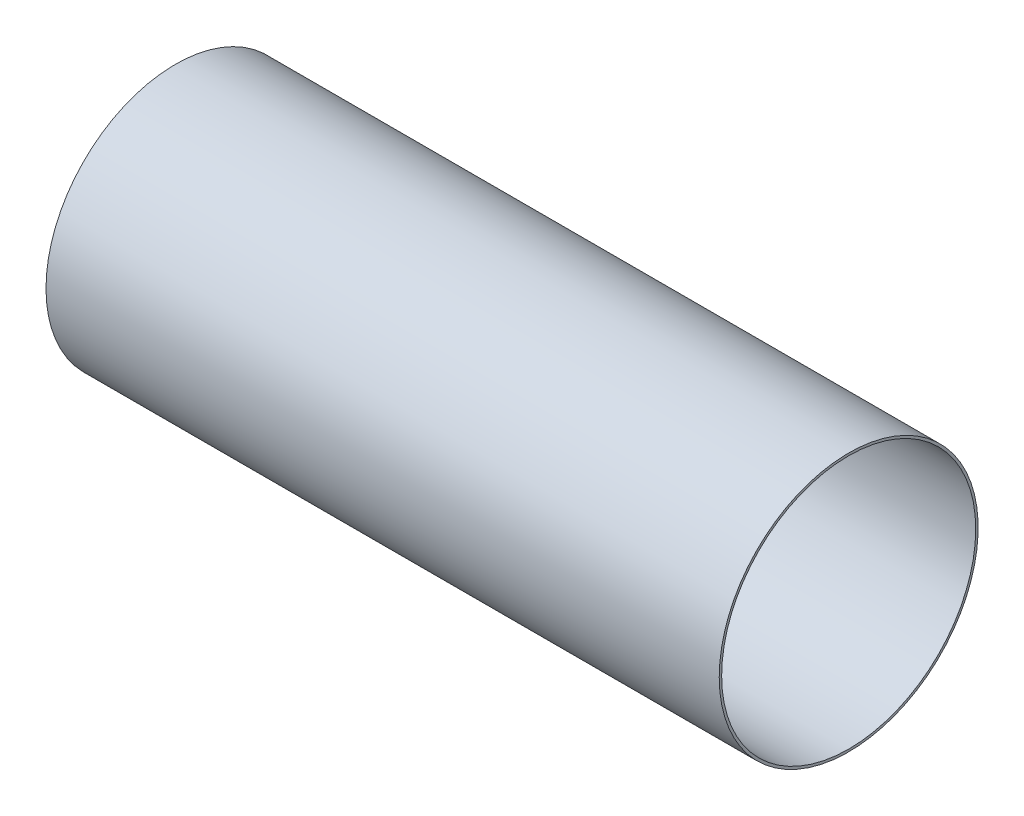
ISO-10303-21;
HEADER;
FILE_DESCRIPTION(('STEP AP214'),'2;1');
FILE_NAME('part.step','',(''),(''),'','','');
FILE_SCHEMA(('AUTOMOTIVE_DESIGN { 1 0 10303 214 1 1 1 1 }'));
ENDSEC;
DATA;
#1=APPLICATION_CONTEXT('core data for automotive mechanical design processes');
#2=APPLICATION_PROTOCOL_DEFINITION('international standard','automotive_design',2000,#1);
#3=PRODUCT_CONTEXT('',#1,'mechanical');
#4=PRODUCT('Part','Part','',(#3));
#5=PRODUCT_RELATED_PRODUCT_CATEGORY('part','',(#4));
#6=PRODUCT_DEFINITION_FORMATION('','',#4);
#7=PRODUCT_DEFINITION_CONTEXT('part definition',#1,'design');
#8=PRODUCT_DEFINITION('design','',#6,#7);
#9=PRODUCT_DEFINITION_SHAPE('','',#8);
#10=(LENGTH_UNIT() NAMED_UNIT(*) SI_UNIT(.MILLI.,.METRE.));
#11=(NAMED_UNIT(*) PLANE_ANGLE_UNIT() SI_UNIT($,.RADIAN.));
#12=(NAMED_UNIT(*) SI_UNIT($,.STERADIAN.) SOLID_ANGLE_UNIT());
#13=UNCERTAINTY_MEASURE_WITH_UNIT(LENGTH_MEASURE(1.E-05),#10,'distance_accuracy_value','');
#14=(GEOMETRIC_REPRESENTATION_CONTEXT(3) GLOBAL_UNCERTAINTY_ASSIGNED_CONTEXT((#13)) GLOBAL_UNIT_ASSIGNED_CONTEXT((#10,
#11,#12)) REPRESENTATION_CONTEXT('',''));
#15=CARTESIAN_POINT('',(0.,0.,0.));
#16=DIRECTION('',(0.,0.,1.));
#17=DIRECTION('',(1.,0.,0.));
#18=AXIS2_PLACEMENT_3D('',#15,#16,#17);
#19=CARTESIAN_POINT('',(832.,0.,0.));
#20=DIRECTION('',(1.,0.,0.));
#21=DIRECTION('',(0.,0.,-1.));
#22=AXIS2_PLACEMENT_3D('',#19,#20,#21);
#23=PLANE('',#22);
#24=CARTESIAN_POINT('',(832.,0.,0.));
#25=DIRECTION('',(1.,0.,0.));
#26=DIRECTION('',(0.,0.,-1.));
#27=AXIS2_PLACEMENT_3D('',#24,#25,#26);
#28=CIRCLE('',#27,160.);
#29=CARTESIAN_POINT('',(832.,0.,160.));
#30=VERTEX_POINT('',#29);
#31=EDGE_CURVE('E10',#30,#30,#28,.T.);
#32=ORIENTED_EDGE('',*,*,#31,.T.);
#33=EDGE_LOOP('',(#32));
#34=FACE_BOUND('',#33,.T.);
#35=CARTESIAN_POINT('',(832.,0.,0.));
#36=DIRECTION('',(1.,0.,0.));
#37=DIRECTION('',(0.,0.,-1.));
#38=AXIS2_PLACEMENT_3D('',#35,#36,#37);
#39=CIRCLE('',#38,157.);
#40=CARTESIAN_POINT('',(832.,0.,157.));
#41=VERTEX_POINT('',#40);
#42=EDGE_CURVE('E50',#41,#41,#39,.T.);
#43=ORIENTED_EDGE('',*,*,#42,.F.);
#44=EDGE_LOOP('',(#43));
#45=FACE_BOUND('',#44,.T.);
#46=ADVANCED_FACE('F37',(#34,#45),#23,.T.);
#47=CARTESIAN_POINT('',(0.,0.,0.));
#48=DIRECTION('',(1.,0.,0.));
#49=DIRECTION('',(0.,0.,-1.));
#50=AXIS2_PLACEMENT_3D('',#47,#48,#49);
#51=PLANE('',#50);
#52=CARTESIAN_POINT('',(0.,0.,0.));
#53=DIRECTION('',(1.,0.,0.));
#54=DIRECTION('',(0.,0.,-1.));
#55=AXIS2_PLACEMENT_3D('',#52,#53,#54);
#56=CIRCLE('',#55,160.);
#57=CARTESIAN_POINT('',(0.,0.,160.));
#58=VERTEX_POINT('',#57);
#59=EDGE_CURVE('E41',#58,#58,#56,.T.);
#60=ORIENTED_EDGE('',*,*,#59,.F.);
#61=EDGE_LOOP('',(#60));
#62=FACE_BOUND('',#61,.T.);
#63=CARTESIAN_POINT('',(0.,0.,0.));
#64=DIRECTION('',(1.,0.,0.));
#65=DIRECTION('',(0.,0.,-1.));
#66=AXIS2_PLACEMENT_3D('',#63,#64,#65);
#67=CIRCLE('',#66,157.);
#68=CARTESIAN_POINT('',(0.,0.,157.));
#69=VERTEX_POINT('',#68);
#70=EDGE_CURVE('E52',#69,#69,#67,.T.);
#71=ORIENTED_EDGE('',*,*,#70,.T.);
#72=EDGE_LOOP('',(#71));
#73=FACE_BOUND('',#72,.T.);
#74=ADVANCED_FACE('F64',(#62,#73),#51,.F.);
#75=CARTESIAN_POINT('',(832.,0.,0.));
#76=DIRECTION('',(-1.,0.,0.));
#77=DIRECTION('',(0.,0.,1.));
#78=AXIS2_PLACEMENT_3D('',#75,#76,#77);
#79=CYLINDRICAL_SURFACE('',#78,160.);
#80=CARTESIAN_POINT('',(832.,0.,160.));
#81=CARTESIAN_POINT('',(823.333333333333,0.,160.));
#82=CARTESIAN_POINT('',(814.666666666667,0.,160.));
#83=CARTESIAN_POINT('',(797.333333333333,0.,160.));
#84=CARTESIAN_POINT('',(788.666666666667,0.,160.));
#85=CARTESIAN_POINT('',(771.333333333333,0.,160.));
#86=CARTESIAN_POINT('',(762.666666666667,0.,160.));
#87=CARTESIAN_POINT('',(745.333333333333,0.,160.));
#88=CARTESIAN_POINT('',(736.666666666667,0.,160.));
#89=CARTESIAN_POINT('',(719.333333333333,0.,160.));
#90=CARTESIAN_POINT('',(710.666666666667,0.,160.));
#91=CARTESIAN_POINT('',(693.333333333333,0.,160.));
#92=CARTESIAN_POINT('',(684.666666666667,0.,160.));
#93=CARTESIAN_POINT('',(667.333333333333,0.,160.));
#94=CARTESIAN_POINT('',(658.666666666667,0.,160.));
#95=CARTESIAN_POINT('',(641.333333333333,0.,160.));
#96=CARTESIAN_POINT('',(632.666666666667,0.,160.));
#97=CARTESIAN_POINT('',(615.333333333333,0.,160.));
#98=CARTESIAN_POINT('',(606.666666666667,0.,160.));
#99=CARTESIAN_POINT('',(589.333333333333,0.,160.));
#100=CARTESIAN_POINT('',(580.666666666667,0.,160.));
#101=CARTESIAN_POINT('',(563.333333333333,0.,160.));
#102=CARTESIAN_POINT('',(554.666666666667,0.,160.));
#103=CARTESIAN_POINT('',(537.333333333333,0.,160.));
#104=CARTESIAN_POINT('',(528.666666666667,0.,160.));
#105=CARTESIAN_POINT('',(511.333333333333,0.,160.));
#106=CARTESIAN_POINT('',(502.666666666667,0.,160.));
#107=CARTESIAN_POINT('',(485.333333333333,0.,160.));
#108=CARTESIAN_POINT('',(476.666666666667,0.,160.));
#109=CARTESIAN_POINT('',(459.333333333333,0.,160.));
#110=CARTESIAN_POINT('',(450.666666666667,0.,160.));
#111=CARTESIAN_POINT('',(433.333333333333,0.,160.));
#112=CARTESIAN_POINT('',(424.666666666667,0.,160.));
#113=CARTESIAN_POINT('',(407.333333333333,0.,160.));
#114=CARTESIAN_POINT('',(398.666666666667,0.,160.));
#115=CARTESIAN_POINT('',(381.333333333333,0.,160.));
#116=CARTESIAN_POINT('',(372.666666666667,0.,160.));
#117=CARTESIAN_POINT('',(355.333333333333,0.,160.));
#118=CARTESIAN_POINT('',(346.666666666667,0.,160.));
#119=CARTESIAN_POINT('',(329.333333333333,0.,160.));
#120=CARTESIAN_POINT('',(320.666666666667,0.,160.));
#121=CARTESIAN_POINT('',(303.333333333333,0.,160.));
#122=CARTESIAN_POINT('',(294.666666666667,0.,160.));
#123=CARTESIAN_POINT('',(277.333333333333,0.,160.));
#124=CARTESIAN_POINT('',(268.666666666667,0.,160.));
#125=CARTESIAN_POINT('',(251.333333333333,0.,160.));
#126=CARTESIAN_POINT('',(242.666666666667,0.,160.));
#127=CARTESIAN_POINT('',(225.333333333333,0.,160.));
#128=CARTESIAN_POINT('',(216.666666666667,0.,160.));
#129=CARTESIAN_POINT('',(199.333333333333,0.,160.));
#130=CARTESIAN_POINT('',(190.666666666667,0.,160.));
#131=CARTESIAN_POINT('',(173.333333333333,0.,160.));
#132=CARTESIAN_POINT('',(164.666666666667,0.,160.));
#133=CARTESIAN_POINT('',(147.333333333333,0.,160.));
#134=CARTESIAN_POINT('',(138.666666666667,0.,160.));
#135=CARTESIAN_POINT('',(121.333333333333,0.,160.));
#136=CARTESIAN_POINT('',(112.666666666667,0.,160.));
#137=CARTESIAN_POINT('',(95.3333333333333,0.,160.));
#138=CARTESIAN_POINT('',(86.6666666666666,0.,160.));
#139=CARTESIAN_POINT('',(69.3333333333333,0.,160.));
#140=CARTESIAN_POINT('',(60.6666666666667,0.,160.));
#141=CARTESIAN_POINT('',(43.3333333333334,0.,160.));
#142=CARTESIAN_POINT('',(34.6666666666667,0.,160.));
#143=CARTESIAN_POINT('',(17.3333333333334,0.,160.));
#144=CARTESIAN_POINT('',(8.66666666666668,0.,160.));
#145=CARTESIAN_POINT('',(0.,0.,160.));
#146=B_SPLINE_CURVE_WITH_KNOTS('',3,(#80,#81,#82,#83,#84,#85,#86,#87,#88,#89,#90,#91,#92,#93,
#94,#95,#96,#97,#98,#99,#100,#101,#102,#103,#104,#105,#106,#107,#108,#109,#110,#111,#112,#113,
#114,#115,#116,#117,#118,#119,#120,#121,#122,#123,#124,#125,#126,#127,#128,#129,#130,#131,#132,
#133,#134,#135,#136,#137,#138,#139,#140,#141,#142,#143,#144,#145),.UNSPECIFIED.,.F.,.F.,(4,2,2,
2,2,2,2,2,2,2,2,2,2,2,2,2,2,2,2,2,2,2,2,2,2,2,2,2,2,2,2,2,4),(0.,25.9999999999999,
51.9999999999999,78.,104.,130.,156.,182.,208.,234.,260.,286.,312.,338.,364.,390.,416.,442.,468.,
494.,520.,546.,572.,598.,624.,650.,676.,702.,728.,754.,780.,806.,832.),.UNSPECIFIED.);
#147=EDGE_CURVE('BSEAM39',#30,#58,#146,.T.);
#148=ORIENTED_EDGE('',*,*,#31,.F.);
#149=ORIENTED_EDGE('',*,*,#59,.T.);
#150=ORIENTED_EDGE('',*,*,#147,.T.);
#151=ORIENTED_EDGE('',*,*,#147,.F.);
#152=EDGE_LOOP('',(#148,#150,#149,#151));
#153=FACE_BOUND('',#152,.T.);
#154=ADVANCED_FACE('F39',(#153),#79,.T.);
#155=CARTESIAN_POINT('',(832.,0.,0.));
#156=DIRECTION('',(-1.,0.,0.));
#157=DIRECTION('',(0.,0.,1.));
#158=AXIS2_PLACEMENT_3D('',#155,#156,#157);
#159=CYLINDRICAL_SURFACE('',#158,157.);
#160=CARTESIAN_POINT('',(832.,0.,157.));
#161=CARTESIAN_POINT('',(823.333333333333,0.,157.));
#162=CARTESIAN_POINT('',(814.666666666667,0.,157.));
#163=CARTESIAN_POINT('',(797.333333333333,0.,157.));
#164=CARTESIAN_POINT('',(788.666666666667,0.,157.));
#165=CARTESIAN_POINT('',(771.333333333333,0.,157.));
#166=CARTESIAN_POINT('',(762.666666666667,0.,157.));
#167=CARTESIAN_POINT('',(745.333333333333,0.,157.));
#168=CARTESIAN_POINT('',(736.666666666667,0.,157.));
#169=CARTESIAN_POINT('',(719.333333333333,0.,157.));
#170=CARTESIAN_POINT('',(710.666666666667,0.,157.));
#171=CARTESIAN_POINT('',(693.333333333333,0.,157.));
#172=CARTESIAN_POINT('',(684.666666666667,0.,157.));
#173=CARTESIAN_POINT('',(667.333333333333,0.,157.));
#174=CARTESIAN_POINT('',(658.666666666667,0.,157.));
#175=CARTESIAN_POINT('',(641.333333333333,0.,157.));
#176=CARTESIAN_POINT('',(632.666666666667,0.,157.));
#177=CARTESIAN_POINT('',(615.333333333333,0.,157.));
#178=CARTESIAN_POINT('',(606.666666666667,0.,157.));
#179=CARTESIAN_POINT('',(589.333333333333,0.,157.));
#180=CARTESIAN_POINT('',(580.666666666667,0.,157.));
#181=CARTESIAN_POINT('',(563.333333333333,0.,157.));
#182=CARTESIAN_POINT('',(554.666666666667,0.,157.));
#183=CARTESIAN_POINT('',(537.333333333333,0.,157.));
#184=CARTESIAN_POINT('',(528.666666666667,0.,157.));
#185=CARTESIAN_POINT('',(511.333333333333,0.,157.));
#186=CARTESIAN_POINT('',(502.666666666667,0.,157.));
#187=CARTESIAN_POINT('',(485.333333333333,0.,157.));
#188=CARTESIAN_POINT('',(476.666666666667,0.,157.));
#189=CARTESIAN_POINT('',(459.333333333333,0.,157.));
#190=CARTESIAN_POINT('',(450.666666666667,0.,157.));
#191=CARTESIAN_POINT('',(433.333333333333,0.,157.));
#192=CARTESIAN_POINT('',(424.666666666667,0.,157.));
#193=CARTESIAN_POINT('',(407.333333333333,0.,157.));
#194=CARTESIAN_POINT('',(398.666666666667,0.,157.));
#195=CARTESIAN_POINT('',(381.333333333333,0.,157.));
#196=CARTESIAN_POINT('',(372.666666666667,0.,157.));
#197=CARTESIAN_POINT('',(355.333333333333,0.,157.));
#198=CARTESIAN_POINT('',(346.666666666667,0.,157.));
#199=CARTESIAN_POINT('',(329.333333333333,0.,157.));
#200=CARTESIAN_POINT('',(320.666666666667,0.,157.));
#201=CARTESIAN_POINT('',(303.333333333333,0.,157.));
#202=CARTESIAN_POINT('',(294.666666666667,0.,157.));
#203=CARTESIAN_POINT('',(277.333333333333,0.,157.));
#204=CARTESIAN_POINT('',(268.666666666667,0.,157.));
#205=CARTESIAN_POINT('',(251.333333333333,0.,157.));
#206=CARTESIAN_POINT('',(242.666666666667,0.,157.));
#207=CARTESIAN_POINT('',(225.333333333333,0.,157.));
#208=CARTESIAN_POINT('',(216.666666666667,0.,157.));
#209=CARTESIAN_POINT('',(199.333333333333,0.,157.));
#210=CARTESIAN_POINT('',(190.666666666667,0.,157.));
#211=CARTESIAN_POINT('',(173.333333333333,0.,157.));
#212=CARTESIAN_POINT('',(164.666666666667,0.,157.));
#213=CARTESIAN_POINT('',(147.333333333333,0.,157.));
#214=CARTESIAN_POINT('',(138.666666666667,0.,157.));
#215=CARTESIAN_POINT('',(121.333333333333,0.,157.));
#216=CARTESIAN_POINT('',(112.666666666667,0.,157.));
#217=CARTESIAN_POINT('',(95.3333333333333,0.,157.));
#218=CARTESIAN_POINT('',(86.6666666666666,0.,157.));
#219=CARTESIAN_POINT('',(69.3333333333333,0.,157.));
#220=CARTESIAN_POINT('',(60.6666666666667,0.,157.));
#221=CARTESIAN_POINT('',(43.3333333333334,0.,157.));
#222=CARTESIAN_POINT('',(34.6666666666667,0.,157.));
#223=CARTESIAN_POINT('',(17.3333333333334,0.,157.));
#224=CARTESIAN_POINT('',(8.66666666666668,0.,157.));
#225=CARTESIAN_POINT('',(0.,0.,157.));
#226=B_SPLINE_CURVE_WITH_KNOTS('',3,(#160,#161,#162,#163,#164,#165,#166,#167,#168,#169,#170,
#171,#172,#173,#174,#175,#176,#177,#178,#179,#180,#181,#182,#183,#184,#185,#186,#187,#188,#189,
#190,#191,#192,#193,#194,#195,#196,#197,#198,#199,#200,#201,#202,#203,#204,#205,#206,#207,#208,
#209,#210,#211,#212,#213,#214,#215,#216,#217,#218,#219,#220,#221,#222,#223,#224,#225),
.UNSPECIFIED.,.F.,.F.,(4,2,2,2,2,2,2,2,2,2,2,2,2,2,2,2,2,2,2,2,2,2,2,2,2,2,2,2,2,2,2,2,4),(0.,
25.9999999999999,51.9999999999999,78.,104.,130.,156.,182.,208.,234.,260.,286.,312.,338.,364.,
390.,416.,442.,468.,494.,520.,546.,572.,598.,624.,650.,676.,702.,728.,754.,780.,806.,832.),.UNSPECIFIED.);
#227=EDGE_CURVE('BSEAM60',#41,#69,#226,.T.);
#228=ORIENTED_EDGE('',*,*,#42,.T.);
#229=ORIENTED_EDGE('',*,*,#70,.F.);
#230=ORIENTED_EDGE('',*,*,#227,.T.);
#231=ORIENTED_EDGE('',*,*,#227,.F.);
#232=EDGE_LOOP('',(#228,#230,#229,#231));
#233=FACE_BOUND('',#232,.T.);
#234=ADVANCED_FACE('F60',(#233),#159,.F.);
#235=CLOSED_SHELL('',(#46,#74,#154,#234));
#236=MANIFOLD_SOLID_BREP('B2',#235);
#237=ADVANCED_BREP_SHAPE_REPRESENTATION('',(#18,#236),#14);
#238=SHAPE_DEFINITION_REPRESENTATION(#9,#237);
ENDSEC;
END-ISO-10303-21;
